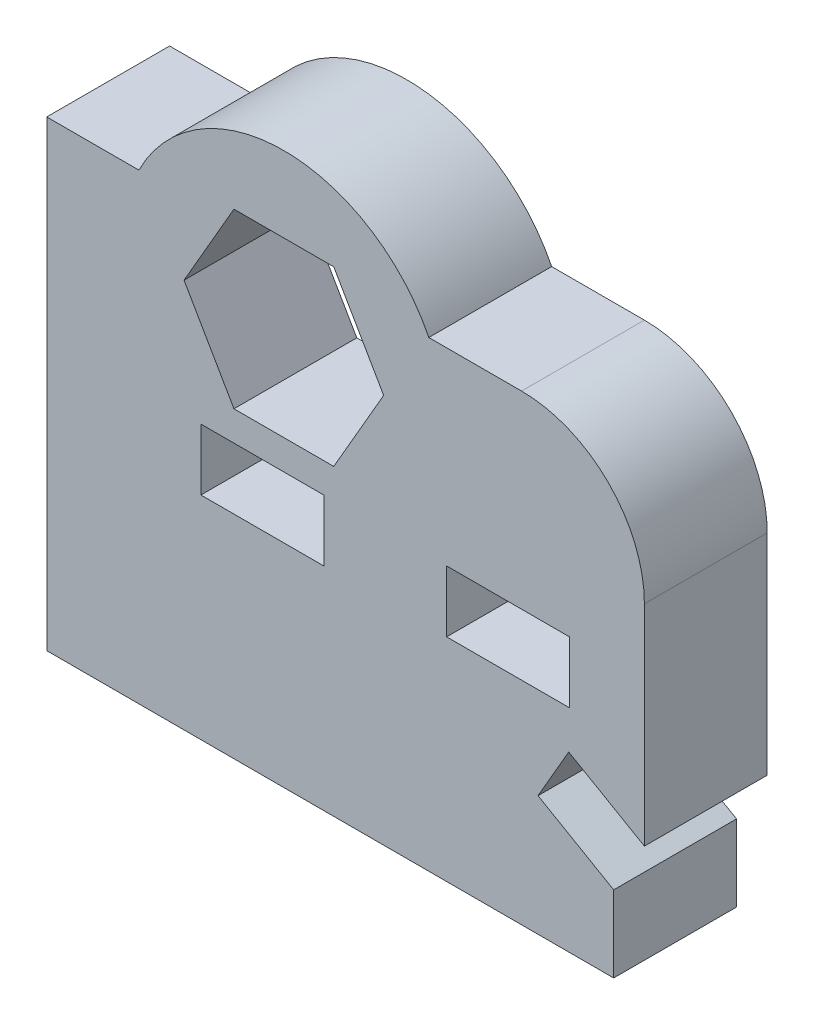
ISO-10303-21;
HEADER;
FILE_DESCRIPTION(('STEP AP214'),'2;1');
FILE_NAME('part.step','',(''),(''),'','','');
FILE_SCHEMA(('AUTOMOTIVE_DESIGN { 1 0 10303 214 1 1 1 1 }'));
ENDSEC;
DATA;
#1=APPLICATION_CONTEXT('core data for automotive mechanical design processes');
#2=APPLICATION_PROTOCOL_DEFINITION('international standard','automotive_design',2000,#1);
#3=PRODUCT_CONTEXT('',#1,'mechanical');
#4=PRODUCT('Part','Part','',(#3));
#5=PRODUCT_RELATED_PRODUCT_CATEGORY('part','',(#4));
#6=PRODUCT_DEFINITION_FORMATION('','',#4);
#7=PRODUCT_DEFINITION_CONTEXT('part definition',#1,'design');
#8=PRODUCT_DEFINITION('design','',#6,#7);
#9=PRODUCT_DEFINITION_SHAPE('','',#8);
#10=(LENGTH_UNIT() NAMED_UNIT(*) SI_UNIT(.MILLI.,.METRE.));
#11=(NAMED_UNIT(*) PLANE_ANGLE_UNIT() SI_UNIT($,.RADIAN.));
#12=(NAMED_UNIT(*) SI_UNIT($,.STERADIAN.) SOLID_ANGLE_UNIT());
#13=UNCERTAINTY_MEASURE_WITH_UNIT(LENGTH_MEASURE(1.E-05),#10,'distance_accuracy_value','');
#14=(GEOMETRIC_REPRESENTATION_CONTEXT(3) GLOBAL_UNCERTAINTY_ASSIGNED_CONTEXT((#13)) GLOBAL_UNIT_ASSIGNED_CONTEXT((#10,
#11,#12)) REPRESENTATION_CONTEXT('',''));
#15=CARTESIAN_POINT('',(0.,0.,0.));
#16=DIRECTION('',(0.,0.,1.));
#17=DIRECTION('',(1.,0.,0.));
#18=AXIS2_PLACEMENT_3D('',#15,#16,#17);
#19=CARTESIAN_POINT('',(13.9396736813884,13.1425512647541,4.));
#20=DIRECTION('',(0.,0.,1.));
#21=DIRECTION('',(1.,0.,0.));
#22=AXIS2_PLACEMENT_3D('',#19,#20,#21);
#23=PLANE('',#22);
#24=DIRECTION('',(0.,-1.,0.));
#25=VECTOR('',#24,1.);
#26=CARTESIAN_POINT('',(11.5,8.99107807997269,4.));
#27=LINE('',#26,#25);
#28=CARTESIAN_POINT('',(11.5,10.9910780799727,4.));
#29=VERTEX_POINT('',#28);
#30=CARTESIAN_POINT('',(11.5,8.99107807997269,4.));
#31=VERTEX_POINT('',#30);
#32=EDGE_CURVE('E252',#29,#31,#27,.T.);
#33=ORIENTED_EDGE('',*,*,#32,.F.);
#34=DIRECTION('',(-1.,0.,0.));
#35=VECTOR('',#34,1.);
#36=CARTESIAN_POINT('',(11.5,10.9910780799727,4.));
#37=LINE('',#36,#35);
#38=CARTESIAN_POINT('',(15.5,10.9910780799727,4.));
#39=VERTEX_POINT('',#38);
#40=EDGE_CURVE('E250',#39,#29,#37,.T.);
#41=ORIENTED_EDGE('',*,*,#40,.F.);
#42=DIRECTION('',(0.,1.,0.));
#43=VECTOR('',#42,1.);
#44=CARTESIAN_POINT('',(15.5,8.99107807997269,4.));
#45=LINE('',#44,#43);
#46=CARTESIAN_POINT('',(15.5,8.99107807997269,4.));
#47=VERTEX_POINT('',#46);
#48=EDGE_CURVE('E258',#47,#39,#45,.T.);
#49=ORIENTED_EDGE('',*,*,#48,.F.);
#50=DIRECTION('',(1.,0.,0.));
#51=VECTOR('',#50,1.);
#52=CARTESIAN_POINT('',(11.5,8.99107807997269,4.));
#53=LINE('',#52,#51);
#54=EDGE_CURVE('E255',#31,#47,#53,.T.);
#55=ORIENTED_EDGE('',*,*,#54,.F.);
#56=EDGE_LOOP('',(#33,#41,#49,#55));
#57=FACE_BOUND('',#56,.T.);
#58=CARTESIAN_POINT('',(13.9396736813884,13.1425512647541,4.));
#59=DIRECTION('',(0.,0.,1.));
#60=DIRECTION('',(1.,0.,0.));
#61=AXIS2_PLACEMENT_3D('',#58,#59,#60);
#62=CIRCLE('',#61,4.);
#63=CARTESIAN_POINT('',(17.9396736813884,13.142551264754,4.));
#64=VERTEX_POINT('',#63);
#65=CARTESIAN_POINT('',(13.9396736813883,17.1425512647541,4.));
#66=VERTEX_POINT('',#65);
#67=EDGE_CURVE('E312',#64,#66,#62,.T.);
#68=ORIENTED_EDGE('',*,*,#67,.T.);
#69=DIRECTION('',(-1.,0.,0.));
#70=VECTOR('',#69,1.);
#71=CARTESIAN_POINT('',(13.9396736813883,17.1425512647541,4.));
#72=LINE('',#71,#70);
#73=CARTESIAN_POINT('',(10.9203263186116,17.1425512647541,4.));
#74=VERTEX_POINT('',#73);
#75=EDGE_CURVE('E315',#66,#74,#72,.T.);
#76=ORIENTED_EDGE('',*,*,#75,.T.);
#77=CARTESIAN_POINT('',(6.2,14.7745717290266,4.));
#78=DIRECTION('',(0.,0.,1.));
#79=DIRECTION('',(1.,0.,0.));
#80=AXIS2_PLACEMENT_3D('',#77,#78,#79);
#81=CIRCLE('',#80,5.28098547960524);
#82=CARTESIAN_POINT('',(1.47967368138841,17.1425512647541,4.));
#83=VERTEX_POINT('',#82);
#84=EDGE_CURVE('E318',#74,#83,#81,.T.);
#85=ORIENTED_EDGE('',*,*,#84,.T.);
#86=DIRECTION('',(-1.,0.,0.));
#87=VECTOR('',#86,1.);
#88=CARTESIAN_POINT('',(1.47967368138841,17.1425512647541,4.));
#89=LINE('',#88,#87);
#90=CARTESIAN_POINT('',(-1.52032631861161,17.1425512647541,4.));
#91=VERTEX_POINT('',#90);
#92=EDGE_CURVE('E320',#83,#91,#89,.T.);
#93=ORIENTED_EDGE('',*,*,#92,.T.);
#94=DIRECTION('',(0.,-1.,0.));
#95=VECTOR('',#94,1.);
#96=CARTESIAN_POINT('',(-1.52032631861161,17.1425512647541,4.));
#97=LINE('',#96,#95);
#98=CARTESIAN_POINT('',(-1.5203263186116,2.0910780799727,4.));
#99=VERTEX_POINT('',#98);
#100=EDGE_CURVE('E322',#91,#99,#97,.T.);
#101=ORIENTED_EDGE('',*,*,#100,.T.);
#102=DIRECTION('',(1.,0.,0.));
#103=VECTOR('',#102,1.);
#104=CARTESIAN_POINT('',(16.9396736813884,2.0910780799727,4.));
#105=LINE('',#104,#103);
#106=CARTESIAN_POINT('',(16.9396736813884,2.0910780799727,4.));
#107=VERTEX_POINT('',#106);
#108=EDGE_CURVE('E324',#99,#107,#105,.T.);
#109=ORIENTED_EDGE('',*,*,#108,.T.);
#110=DIRECTION('',(0.,1.,0.));
#111=VECTOR('',#110,1.);
#112=CARTESIAN_POINT('',(16.9396736813884,4.57735026918963,4.));
#113=LINE('',#112,#111);
#114=CARTESIAN_POINT('',(16.9396736813884,4.57735026918963,4.));
#115=VERTEX_POINT('',#114);
#116=EDGE_CURVE('E326',#107,#115,#113,.T.);
#117=ORIENTED_EDGE('',*,*,#116,.T.);
#118=DIRECTION('',(-0.866025403784442,0.499999999999994,0.));
#119=VECTOR('',#118,1.);
#120=CARTESIAN_POINT('',(14.4755720662506,6.,4.));
#121=LINE('',#120,#119);
#122=CARTESIAN_POINT('',(14.4755720662506,6.,4.));
#123=VERTEX_POINT('',#122);
#124=EDGE_CURVE('E328',#115,#123,#121,.T.);
#125=ORIENTED_EDGE('',*,*,#124,.T.);
#126=DIRECTION('',(0.499999999999994,0.866025403784442,0.));
#127=VECTOR('',#126,1.);
#128=CARTESIAN_POINT('',(14.4755720662506,6.,4.));
#129=LINE('',#128,#127);
#130=CARTESIAN_POINT('',(15.4755720662506,7.73205080756894,4.));
#131=VERTEX_POINT('',#130);
#132=EDGE_CURVE('E330',#123,#131,#129,.T.);
#133=ORIENTED_EDGE('',*,*,#132,.T.);
#134=DIRECTION('',(0.866025403784442,-0.499999999999994,0.));
#135=VECTOR('',#134,1.);
#136=CARTESIAN_POINT('',(15.4755720662506,7.73205080756894,4.));
#137=LINE('',#136,#135);
#138=CARTESIAN_POINT('',(17.9396736813884,6.30940107675856,4.));
#139=VERTEX_POINT('',#138);
#140=EDGE_CURVE('E332',#131,#139,#137,.T.);
#141=ORIENTED_EDGE('',*,*,#140,.T.);
#142=DIRECTION('',(0.,1.,0.));
#143=VECTOR('',#142,1.);
#144=CARTESIAN_POINT('',(17.9396736813884,13.142551264754,4.));
#145=LINE('',#144,#143);
#146=EDGE_CURVE('E334',#139,#64,#145,.T.);
#147=ORIENTED_EDGE('',*,*,#146,.T.);
#148=EDGE_LOOP('',(#68,#76,#85,#93,#101,#109,#117,#125,#133,#141,#147));
#149=FACE_BOUND('',#148,.T.);
#150=DIRECTION('',(0.,-1.,0.));
#151=VECTOR('',#150,1.);
#152=CARTESIAN_POINT('',(3.5,8.99107807997269,4.));
#153=LINE('',#152,#151);
#154=CARTESIAN_POINT('',(3.5,10.9910780799727,4.));
#155=VERTEX_POINT('',#154);
#156=CARTESIAN_POINT('',(3.5,8.99107807997269,4.));
#157=VERTEX_POINT('',#156);
#158=EDGE_CURVE('E283',#155,#157,#153,.T.);
#159=ORIENTED_EDGE('',*,*,#158,.F.);
#160=DIRECTION('',(-1.,0.,0.));
#161=VECTOR('',#160,1.);
#162=CARTESIAN_POINT('',(3.5,10.9910780799727,4.));
#163=LINE('',#162,#161);
#164=CARTESIAN_POINT('',(7.5,10.9910780799727,4.));
#165=VERTEX_POINT('',#164);
#166=EDGE_CURVE('E281',#165,#155,#163,.T.);
#167=ORIENTED_EDGE('',*,*,#166,.F.);
#168=DIRECTION('',(0.,1.,0.));
#169=VECTOR('',#168,1.);
#170=CARTESIAN_POINT('',(7.5,8.99107807997269,4.));
#171=LINE('',#170,#169);
#172=CARTESIAN_POINT('',(7.5,8.99107807997269,4.));
#173=VERTEX_POINT('',#172);
#174=EDGE_CURVE('E289',#173,#165,#171,.T.);
#175=ORIENTED_EDGE('',*,*,#174,.F.);
#176=DIRECTION('',(1.,0.,0.));
#177=VECTOR('',#176,1.);
#178=CARTESIAN_POINT('',(3.5,8.99107807997269,4.));
#179=LINE('',#178,#177);
#180=EDGE_CURVE('E286',#157,#173,#179,.T.);
#181=ORIENTED_EDGE('',*,*,#180,.F.);
#182=EDGE_LOOP('',(#159,#167,#175,#181));
#183=FACE_BOUND('',#182,.T.);
#184=DIRECTION('',(0.499999999999993,-0.866025403784443,0.));
#185=VECTOR('',#184,1.);
#186=CARTESIAN_POINT('',(2.95000000000002,14.7745717290266,4.));
#187=LINE('',#186,#185);
#188=CARTESIAN_POINT('',(2.95000000000002,14.7745717290266,4.));
#189=VERTEX_POINT('',#188);
#190=CARTESIAN_POINT('',(4.57499999999998,11.9599891667272,4.));
#191=VERTEX_POINT('',#190);
#192=EDGE_CURVE('E207',#189,#191,#187,.T.);
#193=ORIENTED_EDGE('',*,*,#192,.F.);
#194=DIRECTION('',(-0.499999999999994,-0.866025403784442,0.));
#195=VECTOR('',#194,1.);
#196=CARTESIAN_POINT('',(4.57499999999998,17.589154291326,4.));
#197=LINE('',#196,#195);
#198=CARTESIAN_POINT('',(4.57499999999998,17.589154291326,4.));
#199=VERTEX_POINT('',#198);
#200=EDGE_CURVE('E199',#199,#189,#197,.T.);
#201=ORIENTED_EDGE('',*,*,#200,.F.);
#202=DIRECTION('',(-1.,0.,0.));
#203=VECTOR('',#202,1.);
#204=CARTESIAN_POINT('',(7.82499999999999,17.589154291326,4.));
#205=LINE('',#204,#203);
#206=CARTESIAN_POINT('',(7.82499999999999,17.589154291326,4.));
#207=VERTEX_POINT('',#206);
#208=EDGE_CURVE('E228',#207,#199,#205,.T.);
#209=ORIENTED_EDGE('',*,*,#208,.F.);
#210=DIRECTION('',(-0.500000000000006,0.866025403784435,0.));
#211=VECTOR('',#210,1.);
#212=CARTESIAN_POINT('',(9.45000000000001,14.7745717290266,4.));
#213=LINE('',#212,#211);
#214=CARTESIAN_POINT('',(9.45000000000001,14.7745717290266,4.));
#215=VERTEX_POINT('',#214);
#216=EDGE_CURVE('E226',#215,#207,#213,.T.);
#217=ORIENTED_EDGE('',*,*,#216,.F.);
#218=DIRECTION('',(0.499999999999995,0.866025403784441,0.));
#219=VECTOR('',#218,1.);
#220=CARTESIAN_POINT('',(7.82500000000002,11.9599891667272,4.));
#221=LINE('',#220,#219);
#222=CARTESIAN_POINT('',(7.82500000000002,11.9599891667272,4.));
#223=VERTEX_POINT('',#222);
#224=EDGE_CURVE('E222',#223,#215,#221,.T.);
#225=ORIENTED_EDGE('',*,*,#224,.F.);
#226=DIRECTION('',(1.,0.,0.));
#227=VECTOR('',#226,1.);
#228=CARTESIAN_POINT('',(4.57499999999998,11.9599891667272,4.));
#229=LINE('',#228,#227);
#230=EDGE_CURVE('E220',#191,#223,#229,.T.);
#231=ORIENTED_EDGE('',*,*,#230,.F.);
#232=EDGE_LOOP('',(#193,#201,#209,#217,#225,#231));
#233=FACE_BOUND('',#232,.T.);
#234=ADVANCED_FACE('F32',(#57,#149,#183,#233),#23,.T.);
#235=CARTESIAN_POINT('',(13.9396736813884,13.1425512647541,0.));
#236=DIRECTION('',(0.,0.,1.));
#237=DIRECTION('',(1.,0.,0.));
#238=AXIS2_PLACEMENT_3D('',#235,#236,#237);
#239=PLANE('',#238);
#240=DIRECTION('',(-1.,0.,0.));
#241=VECTOR('',#240,1.);
#242=CARTESIAN_POINT('',(11.5,10.9910780799727,0.));
#243=LINE('',#242,#241);
#244=CARTESIAN_POINT('',(15.5,10.9910780799727,0.));
#245=VERTEX_POINT('',#244);
#246=CARTESIAN_POINT('',(11.5,10.9910780799727,0.));
#247=VERTEX_POINT('',#246);
#248=EDGE_CURVE('E215',#245,#247,#243,.T.);
#249=ORIENTED_EDGE('',*,*,#248,.T.);
#250=DIRECTION('',(0.,-1.,0.));
#251=VECTOR('',#250,1.);
#252=CARTESIAN_POINT('',(11.5,8.99107807997269,0.));
#253=LINE('',#252,#251);
#254=CARTESIAN_POINT('',(11.5,8.99107807997269,0.));
#255=VERTEX_POINT('',#254);
#256=EDGE_CURVE('E263',#247,#255,#253,.T.);
#257=ORIENTED_EDGE('',*,*,#256,.T.);
#258=DIRECTION('',(1.,0.,0.));
#259=VECTOR('',#258,1.);
#260=CARTESIAN_POINT('',(11.5,8.99107807997269,0.));
#261=LINE('',#260,#259);
#262=CARTESIAN_POINT('',(15.5,8.99107807997269,0.));
#263=VERTEX_POINT('',#262);
#264=EDGE_CURVE('E266',#255,#263,#261,.T.);
#265=ORIENTED_EDGE('',*,*,#264,.T.);
#266=DIRECTION('',(0.,1.,0.));
#267=VECTOR('',#266,1.);
#268=CARTESIAN_POINT('',(15.5,8.99107807997269,0.));
#269=LINE('',#268,#267);
#270=EDGE_CURVE('E253',#263,#245,#269,.T.);
#271=ORIENTED_EDGE('',*,*,#270,.T.);
#272=EDGE_LOOP('',(#249,#257,#265,#271));
#273=FACE_BOUND('',#272,.T.);
#274=CARTESIAN_POINT('',(13.9396736813884,13.1425512647541,0.));
#275=DIRECTION('',(0.,0.,1.));
#276=DIRECTION('',(1.,0.,0.));
#277=AXIS2_PLACEMENT_3D('',#274,#275,#276);
#278=CIRCLE('',#277,4.);
#279=CARTESIAN_POINT('',(17.9396736813884,13.142551264754,0.));
#280=VERTEX_POINT('',#279);
#281=CARTESIAN_POINT('',(13.9396736813883,17.1425512647541,0.));
#282=VERTEX_POINT('',#281);
#283=EDGE_CURVE('E311',#280,#282,#278,.T.);
#284=ORIENTED_EDGE('',*,*,#283,.F.);
#285=DIRECTION('',(0.,1.,0.));
#286=VECTOR('',#285,1.);
#287=CARTESIAN_POINT('',(17.9396736813884,13.142551264754,0.));
#288=LINE('',#287,#286);
#289=CARTESIAN_POINT('',(17.9396736813884,6.30940107675856,0.));
#290=VERTEX_POINT('',#289);
#291=EDGE_CURVE('E316',#290,#280,#288,.T.);
#292=ORIENTED_EDGE('',*,*,#291,.F.);
#293=DIRECTION('',(0.866025403784442,-0.499999999999994,0.));
#294=VECTOR('',#293,1.);
#295=CARTESIAN_POINT('',(15.4755720662506,7.73205080756894,0.));
#296=LINE('',#295,#294);
#297=CARTESIAN_POINT('',(15.4755720662506,7.73205080756894,0.));
#298=VERTEX_POINT('',#297);
#299=EDGE_CURVE('E355',#298,#290,#296,.T.);
#300=ORIENTED_EDGE('',*,*,#299,.F.);
#301=DIRECTION('',(0.499999999999994,0.866025403784442,0.));
#302=VECTOR('',#301,1.);
#303=CARTESIAN_POINT('',(14.4755720662506,6.,0.));
#304=LINE('',#303,#302);
#305=CARTESIAN_POINT('',(14.4755720662506,6.,0.));
#306=VERTEX_POINT('',#305);
#307=EDGE_CURVE('E353',#306,#298,#304,.T.);
#308=ORIENTED_EDGE('',*,*,#307,.F.);
#309=DIRECTION('',(-0.866025403784442,0.499999999999994,0.));
#310=VECTOR('',#309,1.);
#311=CARTESIAN_POINT('',(14.4755720662506,6.,0.));
#312=LINE('',#311,#310);
#313=CARTESIAN_POINT('',(16.9396736813884,4.57735026918963,0.));
#314=VERTEX_POINT('',#313);
#315=EDGE_CURVE('E351',#314,#306,#312,.T.);
#316=ORIENTED_EDGE('',*,*,#315,.F.);
#317=DIRECTION('',(0.,1.,0.));
#318=VECTOR('',#317,1.);
#319=CARTESIAN_POINT('',(16.9396736813884,4.57735026918963,0.));
#320=LINE('',#319,#318);
#321=CARTESIAN_POINT('',(16.9396736813884,2.0910780799727,0.));
#322=VERTEX_POINT('',#321);
#323=EDGE_CURVE('E349',#322,#314,#320,.T.);
#324=ORIENTED_EDGE('',*,*,#323,.F.);
#325=DIRECTION('',(1.,0.,0.));
#326=VECTOR('',#325,1.);
#327=CARTESIAN_POINT('',(16.9396736813884,2.0910780799727,0.));
#328=LINE('',#327,#326);
#329=CARTESIAN_POINT('',(-1.5203263186116,2.0910780799727,0.));
#330=VERTEX_POINT('',#329);
#331=EDGE_CURVE('E347',#330,#322,#328,.T.);
#332=ORIENTED_EDGE('',*,*,#331,.F.);
#333=DIRECTION('',(0.,-1.,0.));
#334=VECTOR('',#333,1.);
#335=CARTESIAN_POINT('',(-1.52032631861161,17.1425512647541,0.));
#336=LINE('',#335,#334);
#337=CARTESIAN_POINT('',(-1.52032631861161,17.1425512647541,0.));
#338=VERTEX_POINT('',#337);
#339=EDGE_CURVE('E345',#338,#330,#336,.T.);
#340=ORIENTED_EDGE('',*,*,#339,.F.);
#341=DIRECTION('',(-1.,0.,0.));
#342=VECTOR('',#341,1.);
#343=CARTESIAN_POINT('',(1.47967368138841,17.1425512647541,0.));
#344=LINE('',#343,#342);
#345=CARTESIAN_POINT('',(1.47967368138841,17.1425512647541,0.));
#346=VERTEX_POINT('',#345);
#347=EDGE_CURVE('E343',#346,#338,#344,.T.);
#348=ORIENTED_EDGE('',*,*,#347,.F.);
#349=CARTESIAN_POINT('',(6.2,14.7745717290266,0.));
#350=DIRECTION('',(0.,0.,1.));
#351=DIRECTION('',(1.,0.,0.));
#352=AXIS2_PLACEMENT_3D('',#349,#350,#351);
#353=CIRCLE('',#352,5.28098547960524);
#354=CARTESIAN_POINT('',(10.9203263186116,17.1425512647541,0.));
#355=VERTEX_POINT('',#354);
#356=EDGE_CURVE('E341',#355,#346,#353,.T.);
#357=ORIENTED_EDGE('',*,*,#356,.F.);
#358=DIRECTION('',(-1.,0.,0.));
#359=VECTOR('',#358,1.);
#360=CARTESIAN_POINT('',(13.9396736813883,17.1425512647541,0.));
#361=LINE('',#360,#359);
#362=EDGE_CURVE('E339',#282,#355,#361,.T.);
#363=ORIENTED_EDGE('',*,*,#362,.F.);
#364=EDGE_LOOP('',(#284,#292,#300,#308,#316,#324,#332,#340,#348,#357,#363));
#365=FACE_BOUND('',#364,.T.);
#366=DIRECTION('',(-1.,0.,0.));
#367=VECTOR('',#366,1.);
#368=CARTESIAN_POINT('',(3.5,10.9910780799727,0.));
#369=LINE('',#368,#367);
#370=CARTESIAN_POINT('',(7.5,10.9910780799727,0.));
#371=VERTEX_POINT('',#370);
#372=CARTESIAN_POINT('',(3.5,10.9910780799727,0.));
#373=VERTEX_POINT('',#372);
#374=EDGE_CURVE('E280',#371,#373,#369,.T.);
#375=ORIENTED_EDGE('',*,*,#374,.T.);
#376=DIRECTION('',(0.,-1.,0.));
#377=VECTOR('',#376,1.);
#378=CARTESIAN_POINT('',(3.5,8.99107807997269,0.));
#379=LINE('',#378,#377);
#380=CARTESIAN_POINT('',(3.5,8.99107807997269,0.));
#381=VERTEX_POINT('',#380);
#382=EDGE_CURVE('E294',#373,#381,#379,.T.);
#383=ORIENTED_EDGE('',*,*,#382,.T.);
#384=DIRECTION('',(1.,0.,0.));
#385=VECTOR('',#384,1.);
#386=CARTESIAN_POINT('',(3.5,8.99107807997269,0.));
#387=LINE('',#386,#385);
#388=CARTESIAN_POINT('',(7.5,8.99107807997269,0.));
#389=VERTEX_POINT('',#388);
#390=EDGE_CURVE('E297',#381,#389,#387,.T.);
#391=ORIENTED_EDGE('',*,*,#390,.T.);
#392=DIRECTION('',(0.,1.,0.));
#393=VECTOR('',#392,1.);
#394=CARTESIAN_POINT('',(7.5,8.99107807997269,0.));
#395=LINE('',#394,#393);
#396=EDGE_CURVE('E284',#389,#371,#395,.T.);
#397=ORIENTED_EDGE('',*,*,#396,.T.);
#398=EDGE_LOOP('',(#375,#383,#391,#397));
#399=FACE_BOUND('',#398,.T.);
#400=DIRECTION('',(-0.499999999999994,-0.866025403784442,0.));
#401=VECTOR('',#400,1.);
#402=CARTESIAN_POINT('',(4.57499999999998,17.589154291326,0.));
#403=LINE('',#402,#401);
#404=CARTESIAN_POINT('',(4.57499999999998,17.589154291326,0.));
#405=VERTEX_POINT('',#404);
#406=CARTESIAN_POINT('',(2.95000000000002,14.7745717290266,0.));
#407=VERTEX_POINT('',#406);
#408=EDGE_CURVE('E55',#405,#407,#403,.T.);
#409=ORIENTED_EDGE('',*,*,#408,.T.);
#410=DIRECTION('',(0.499999999999993,-0.866025403784443,0.));
#411=VECTOR('',#410,1.);
#412=CARTESIAN_POINT('',(2.95000000000002,14.7745717290266,0.));
#413=LINE('',#412,#411);
#414=CARTESIAN_POINT('',(4.57499999999998,11.9599891667272,0.));
#415=VERTEX_POINT('',#414);
#416=EDGE_CURVE('E214',#407,#415,#413,.T.);
#417=ORIENTED_EDGE('',*,*,#416,.T.);
#418=DIRECTION('',(1.,0.,0.));
#419=VECTOR('',#418,1.);
#420=CARTESIAN_POINT('',(4.57499999999998,11.9599891667272,0.));
#421=LINE('',#420,#419);
#422=CARTESIAN_POINT('',(7.82500000000002,11.9599891667272,0.));
#423=VERTEX_POINT('',#422);
#424=EDGE_CURVE('E232',#415,#423,#421,.T.);
#425=ORIENTED_EDGE('',*,*,#424,.T.);
#426=DIRECTION('',(0.499999999999995,0.866025403784441,0.));
#427=VECTOR('',#426,1.);
#428=CARTESIAN_POINT('',(7.82500000000002,11.9599891667272,0.));
#429=LINE('',#428,#427);
#430=CARTESIAN_POINT('',(9.45000000000001,14.7745717290266,0.));
#431=VERTEX_POINT('',#430);
#432=EDGE_CURVE('E235',#423,#431,#429,.T.);
#433=ORIENTED_EDGE('',*,*,#432,.T.);
#434=DIRECTION('',(-0.500000000000006,0.866025403784435,0.));
#435=VECTOR('',#434,1.);
#436=CARTESIAN_POINT('',(9.45000000000001,14.7745717290266,0.));
#437=LINE('',#436,#435);
#438=CARTESIAN_POINT('',(7.82499999999999,17.589154291326,0.));
#439=VERTEX_POINT('',#438);
#440=EDGE_CURVE('E238',#431,#439,#437,.T.);
#441=ORIENTED_EDGE('',*,*,#440,.T.);
#442=DIRECTION('',(-1.,0.,0.));
#443=VECTOR('',#442,1.);
#444=CARTESIAN_POINT('',(7.82499999999999,17.589154291326,0.));
#445=LINE('',#444,#443);
#446=EDGE_CURVE('E208',#439,#405,#445,.T.);
#447=ORIENTED_EDGE('',*,*,#446,.T.);
#448=EDGE_LOOP('',(#409,#417,#425,#433,#441,#447));
#449=FACE_BOUND('',#448,.T.);
#450=ADVANCED_FACE('F394',(#273,#365,#399,#449),#239,.F.);
#451=CARTESIAN_POINT('',(13.9396736813884,13.1425512647541,4.));
#452=DIRECTION('',(0.,0.,-1.));
#453=DIRECTION('',(-1.,0.,0.));
#454=AXIS2_PLACEMENT_3D('',#451,#452,#453);
#455=CYLINDRICAL_SURFACE('',#454,4.);
#456=ORIENTED_EDGE('',*,*,#283,.T.);
#457=DIRECTION('',(0.,0.,-1.));
#458=VECTOR('',#457,1.);
#459=CARTESIAN_POINT('',(13.9396736813883,17.1425512647541,4.));
#460=LINE('',#459,#458);
#461=EDGE_CURVE('E11',#66,#282,#460,.T.);
#462=ORIENTED_EDGE('',*,*,#461,.F.);
#463=ORIENTED_EDGE('',*,*,#67,.F.);
#464=DIRECTION('',(0.,0.,-1.));
#465=VECTOR('',#464,1.);
#466=CARTESIAN_POINT('',(17.9396736813884,13.142551264754,4.));
#467=LINE('',#466,#465);
#468=EDGE_CURVE('E336',#64,#280,#467,.T.);
#469=ORIENTED_EDGE('',*,*,#468,.T.);
#470=EDGE_LOOP('',(#456,#462,#463,#469));
#471=FACE_BOUND('',#470,.T.);
#472=ADVANCED_FACE('F34',(#471),#455,.T.);
#473=CARTESIAN_POINT('',(13.9396736813883,17.1425512647541,4.));
#474=DIRECTION('',(0.,-1.,0.));
#475=DIRECTION('',(1.,0.,0.));
#476=AXIS2_PLACEMENT_3D('',#473,#474,#475);
#477=PLANE('',#476);
#478=ORIENTED_EDGE('',*,*,#362,.T.);
#479=DIRECTION('',(0.,0.,-1.));
#480=VECTOR('',#479,1.);
#481=CARTESIAN_POINT('',(10.9203263186116,17.1425512647541,4.));
#482=LINE('',#481,#480);
#483=EDGE_CURVE('E40',#74,#355,#482,.T.);
#484=ORIENTED_EDGE('',*,*,#483,.F.);
#485=ORIENTED_EDGE('',*,*,#75,.F.);
#486=ORIENTED_EDGE('',*,*,#461,.T.);
#487=EDGE_LOOP('',(#478,#484,#485,#486));
#488=FACE_BOUND('',#487,.T.);
#489=ADVANCED_FACE('F412',(#488),#477,.F.);
#490=CARTESIAN_POINT('',(6.2,14.7745717290266,4.));
#491=DIRECTION('',(0.,0.,-1.));
#492=DIRECTION('',(-1.,0.,0.));
#493=AXIS2_PLACEMENT_3D('',#490,#491,#492);
#494=CYLINDRICAL_SURFACE('',#493,5.28098547960524);
#495=ORIENTED_EDGE('',*,*,#356,.T.);
#496=DIRECTION('',(0.,0.,-1.));
#497=VECTOR('',#496,1.);
#498=CARTESIAN_POINT('',(1.47967368138841,17.1425512647541,4.));
#499=LINE('',#498,#497);
#500=EDGE_CURVE('E381',#83,#346,#499,.T.);
#501=ORIENTED_EDGE('',*,*,#500,.F.);
#502=ORIENTED_EDGE('',*,*,#84,.F.);
#503=ORIENTED_EDGE('',*,*,#483,.T.);
#504=EDGE_LOOP('',(#495,#501,#502,#503));
#505=FACE_BOUND('',#504,.T.);
#506=ADVANCED_FACE('F388',(#505),#494,.T.);
#507=CARTESIAN_POINT('',(1.47967368138841,17.1425512647541,4.));
#508=DIRECTION('',(0.,-1.,0.));
#509=DIRECTION('',(0.,0.,-1.));
#510=AXIS2_PLACEMENT_3D('',#507,#508,#509);
#511=PLANE('',#510);
#512=ORIENTED_EDGE('',*,*,#347,.T.);
#513=DIRECTION('',(0.,0.,-1.));
#514=VECTOR('',#513,1.);
#515=CARTESIAN_POINT('',(-1.52032631861161,17.1425512647541,4.));
#516=LINE('',#515,#514);
#517=EDGE_CURVE('E378',#91,#338,#516,.T.);
#518=ORIENTED_EDGE('',*,*,#517,.F.);
#519=ORIENTED_EDGE('',*,*,#92,.F.);
#520=ORIENTED_EDGE('',*,*,#500,.T.);
#521=EDGE_LOOP('',(#512,#518,#519,#520));
#522=FACE_BOUND('',#521,.T.);
#523=ADVANCED_FACE('F400',(#522),#511,.F.);
#524=CARTESIAN_POINT('',(-1.52032631861161,17.1425512647541,4.));
#525=DIRECTION('',(1.,0.,0.));
#526=DIRECTION('',(0.,1.,0.));
#527=AXIS2_PLACEMENT_3D('',#524,#525,#526);
#528=PLANE('',#527);
#529=ORIENTED_EDGE('',*,*,#339,.T.);
#530=DIRECTION('',(0.,0.,-1.));
#531=VECTOR('',#530,1.);
#532=CARTESIAN_POINT('',(-1.5203263186116,2.0910780799727,4.));
#533=LINE('',#532,#531);
#534=EDGE_CURVE('E375',#99,#330,#533,.T.);
#535=ORIENTED_EDGE('',*,*,#534,.F.);
#536=ORIENTED_EDGE('',*,*,#100,.F.);
#537=ORIENTED_EDGE('',*,*,#517,.T.);
#538=EDGE_LOOP('',(#529,#535,#536,#537));
#539=FACE_BOUND('',#538,.T.);
#540=ADVANCED_FACE('F404',(#539),#528,.F.);
#541=CARTESIAN_POINT('',(16.9396736813884,2.0910780799727,4.));
#542=DIRECTION('',(0.,1.,0.));
#543=DIRECTION('',(-1.,0.,0.));
#544=AXIS2_PLACEMENT_3D('',#541,#542,#543);
#545=PLANE('',#544);
#546=ORIENTED_EDGE('',*,*,#331,.T.);
#547=DIRECTION('',(0.,0.,-1.));
#548=VECTOR('',#547,1.);
#549=CARTESIAN_POINT('',(16.9396736813884,2.0910780799727,4.));
#550=LINE('',#549,#548);
#551=EDGE_CURVE('E372',#107,#322,#550,.T.);
#552=ORIENTED_EDGE('',*,*,#551,.F.);
#553=ORIENTED_EDGE('',*,*,#108,.F.);
#554=ORIENTED_EDGE('',*,*,#534,.T.);
#555=EDGE_LOOP('',(#546,#552,#553,#554));
#556=FACE_BOUND('',#555,.T.);
#557=ADVANCED_FACE('F440',(#556),#545,.F.);
#558=CARTESIAN_POINT('',(16.9396736813884,4.57735026918963,4.));
#559=DIRECTION('',(-1.,0.,0.));
#560=DIRECTION('',(0.,-1.,0.));
#561=AXIS2_PLACEMENT_3D('',#558,#559,#560);
#562=PLANE('',#561);
#563=ORIENTED_EDGE('',*,*,#323,.T.);
#564=DIRECTION('',(0.,0.,-1.));
#565=VECTOR('',#564,1.);
#566=CARTESIAN_POINT('',(16.9396736813884,4.57735026918963,4.));
#567=LINE('',#566,#565);
#568=EDGE_CURVE('E369',#115,#314,#567,.T.);
#569=ORIENTED_EDGE('',*,*,#568,.F.);
#570=ORIENTED_EDGE('',*,*,#116,.F.);
#571=ORIENTED_EDGE('',*,*,#551,.T.);
#572=EDGE_LOOP('',(#563,#569,#570,#571));
#573=FACE_BOUND('',#572,.T.);
#574=ADVANCED_FACE('F438',(#573),#562,.F.);
#575=CARTESIAN_POINT('',(14.4755720662506,6.,4.));
#576=DIRECTION('',(-0.499999999999994,-0.866025403784442,0.));
#577=DIRECTION('',(0.866025403784442,-0.499999999999994,0.));
#578=AXIS2_PLACEMENT_3D('',#575,#576,#577);
#579=PLANE('',#578);
#580=ORIENTED_EDGE('',*,*,#315,.T.);
#581=DIRECTION('',(0.,0.,-1.));
#582=VECTOR('',#581,1.);
#583=CARTESIAN_POINT('',(14.4755720662506,6.,4.));
#584=LINE('',#583,#582);
#585=EDGE_CURVE('E366',#123,#306,#584,.T.);
#586=ORIENTED_EDGE('',*,*,#585,.F.);
#587=ORIENTED_EDGE('',*,*,#124,.F.);
#588=ORIENTED_EDGE('',*,*,#568,.T.);
#589=EDGE_LOOP('',(#580,#586,#587,#588));
#590=FACE_BOUND('',#589,.T.);
#591=ADVANCED_FACE('F433',(#590),#579,.F.);
#592=CARTESIAN_POINT('',(14.4755720662506,6.,4.));
#593=DIRECTION('',(-0.866025403784442,0.499999999999994,0.));
#594=DIRECTION('',(-0.499999999999994,-0.866025403784442,0.));
#595=AXIS2_PLACEMENT_3D('',#592,#593,#594);
#596=PLANE('',#595);
#597=ORIENTED_EDGE('',*,*,#307,.T.);
#598=DIRECTION('',(0.,0.,-1.));
#599=VECTOR('',#598,1.);
#600=CARTESIAN_POINT('',(15.4755720662506,7.73205080756894,4.));
#601=LINE('',#600,#599);
#602=EDGE_CURVE('E363',#131,#298,#601,.T.);
#603=ORIENTED_EDGE('',*,*,#602,.F.);
#604=ORIENTED_EDGE('',*,*,#132,.F.);
#605=ORIENTED_EDGE('',*,*,#585,.T.);
#606=EDGE_LOOP('',(#597,#603,#604,#605));
#607=FACE_BOUND('',#606,.T.);
#608=ADVANCED_FACE('F428',(#607),#596,.F.);
#609=CARTESIAN_POINT('',(15.4755720662506,7.73205080756894,4.));
#610=DIRECTION('',(0.499999999999994,0.866025403784442,0.));
#611=DIRECTION('',(-0.866025403784442,0.499999999999994,0.));
#612=AXIS2_PLACEMENT_3D('',#609,#610,#611);
#613=PLANE('',#612);
#614=ORIENTED_EDGE('',*,*,#299,.T.);
#615=DIRECTION('',(0.,0.,-1.));
#616=VECTOR('',#615,1.);
#617=CARTESIAN_POINT('',(17.9396736813884,6.30940107675856,4.));
#618=LINE('',#617,#616);
#619=EDGE_CURVE('E360',#139,#290,#618,.T.);
#620=ORIENTED_EDGE('',*,*,#619,.F.);
#621=ORIENTED_EDGE('',*,*,#140,.F.);
#622=ORIENTED_EDGE('',*,*,#602,.T.);
#623=EDGE_LOOP('',(#614,#620,#621,#622));
#624=FACE_BOUND('',#623,.T.);
#625=ADVANCED_FACE('F424',(#624),#613,.F.);
#626=CARTESIAN_POINT('',(17.9396736813884,13.142551264754,4.));
#627=DIRECTION('',(-1.,0.,0.));
#628=DIRECTION('',(0.,-1.,0.));
#629=AXIS2_PLACEMENT_3D('',#626,#627,#628);
#630=PLANE('',#629);
#631=ORIENTED_EDGE('',*,*,#291,.T.);
#632=ORIENTED_EDGE('',*,*,#468,.F.);
#633=ORIENTED_EDGE('',*,*,#146,.F.);
#634=ORIENTED_EDGE('',*,*,#619,.T.);
#635=EDGE_LOOP('',(#631,#632,#633,#634));
#636=FACE_BOUND('',#635,.T.);
#637=ADVANCED_FACE('F419',(#636),#630,.F.);
#638=CARTESIAN_POINT('',(3.5,10.9910780799727,4.));
#639=DIRECTION('',(0.,-1.,0.));
#640=DIRECTION('',(0.,0.,-1.));
#641=AXIS2_PLACEMENT_3D('',#638,#639,#640);
#642=PLANE('',#641);
#643=ORIENTED_EDGE('',*,*,#374,.F.);
#644=DIRECTION('',(0.,0.,-1.));
#645=VECTOR('',#644,1.);
#646=CARTESIAN_POINT('',(7.5,10.9910780799727,4.));
#647=LINE('',#646,#645);
#648=EDGE_CURVE('E291',#165,#371,#647,.T.);
#649=ORIENTED_EDGE('',*,*,#648,.F.);
#650=ORIENTED_EDGE('',*,*,#166,.T.);
#651=DIRECTION('',(0.,0.,-1.));
#652=VECTOR('',#651,1.);
#653=CARTESIAN_POINT('',(3.5,10.9910780799727,4.));
#654=LINE('',#653,#652);
#655=EDGE_CURVE('E308',#155,#373,#654,.T.);
#656=ORIENTED_EDGE('',*,*,#655,.T.);
#657=EDGE_LOOP('',(#643,#649,#650,#656));
#658=FACE_BOUND('',#657,.T.);
#659=ADVANCED_FACE('F459',(#658),#642,.T.);
#660=CARTESIAN_POINT('',(3.5,8.99107807997269,4.));
#661=DIRECTION('',(1.,0.,0.));
#662=DIRECTION('',(0.,0.,-1.));
#663=AXIS2_PLACEMENT_3D('',#660,#661,#662);
#664=PLANE('',#663);
#665=ORIENTED_EDGE('',*,*,#382,.F.);
#666=ORIENTED_EDGE('',*,*,#655,.F.);
#667=ORIENTED_EDGE('',*,*,#158,.T.);
#668=DIRECTION('',(0.,0.,-1.));
#669=VECTOR('',#668,1.);
#670=CARTESIAN_POINT('',(3.5,8.99107807997269,4.));
#671=LINE('',#670,#669);
#672=EDGE_CURVE('E306',#157,#381,#671,.T.);
#673=ORIENTED_EDGE('',*,*,#672,.T.);
#674=EDGE_LOOP('',(#665,#666,#667,#673));
#675=FACE_BOUND('',#674,.T.);
#676=ADVANCED_FACE('F491',(#675),#664,.T.);
#677=CARTESIAN_POINT('',(3.5,8.99107807997269,4.));
#678=DIRECTION('',(0.,1.,0.));
#679=DIRECTION('',(0.,0.,1.));
#680=AXIS2_PLACEMENT_3D('',#677,#678,#679);
#681=PLANE('',#680);
#682=ORIENTED_EDGE('',*,*,#390,.F.);
#683=ORIENTED_EDGE('',*,*,#672,.F.);
#684=ORIENTED_EDGE('',*,*,#180,.T.);
#685=DIRECTION('',(0.,0.,-1.));
#686=VECTOR('',#685,1.);
#687=CARTESIAN_POINT('',(7.5,8.99107807997269,4.));
#688=LINE('',#687,#686);
#689=EDGE_CURVE('E304',#173,#389,#688,.T.);
#690=ORIENTED_EDGE('',*,*,#689,.T.);
#691=EDGE_LOOP('',(#682,#683,#684,#690));
#692=FACE_BOUND('',#691,.T.);
#693=ADVANCED_FACE('F498',(#692),#681,.T.);
#694=CARTESIAN_POINT('',(7.5,8.99107807997269,4.));
#695=DIRECTION('',(-1.,0.,0.));
#696=DIRECTION('',(0.,0.,1.));
#697=AXIS2_PLACEMENT_3D('',#694,#695,#696);
#698=PLANE('',#697);
#699=ORIENTED_EDGE('',*,*,#396,.F.);
#700=ORIENTED_EDGE('',*,*,#689,.F.);
#701=ORIENTED_EDGE('',*,*,#174,.T.);
#702=ORIENTED_EDGE('',*,*,#648,.T.);
#703=EDGE_LOOP('',(#699,#700,#701,#702));
#704=FACE_BOUND('',#703,.T.);
#705=ADVANCED_FACE('F505',(#704),#698,.T.);
#706=CARTESIAN_POINT('',(11.5,10.9910780799727,4.));
#707=DIRECTION('',(0.,-1.,0.));
#708=DIRECTION('',(0.,0.,-1.));
#709=AXIS2_PLACEMENT_3D('',#706,#707,#708);
#710=PLANE('',#709);
#711=ORIENTED_EDGE('',*,*,#248,.F.);
#712=DIRECTION('',(0.,0.,-1.));
#713=VECTOR('',#712,1.);
#714=CARTESIAN_POINT('',(15.5,10.9910780799727,4.));
#715=LINE('',#714,#713);
#716=EDGE_CURVE('E260',#39,#245,#715,.T.);
#717=ORIENTED_EDGE('',*,*,#716,.F.);
#718=ORIENTED_EDGE('',*,*,#40,.T.);
#719=DIRECTION('',(0.,0.,-1.));
#720=VECTOR('',#719,1.);
#721=CARTESIAN_POINT('',(11.5,10.9910780799727,4.));
#722=LINE('',#721,#720);
#723=EDGE_CURVE('E277',#29,#247,#722,.T.);
#724=ORIENTED_EDGE('',*,*,#723,.T.);
#725=EDGE_LOOP('',(#711,#717,#718,#724));
#726=FACE_BOUND('',#725,.T.);
#727=ADVANCED_FACE('F513',(#726),#710,.T.);
#728=CARTESIAN_POINT('',(11.5,8.99107807997269,4.));
#729=DIRECTION('',(1.,0.,0.));
#730=DIRECTION('',(0.,0.,-1.));
#731=AXIS2_PLACEMENT_3D('',#728,#729,#730);
#732=PLANE('',#731);
#733=ORIENTED_EDGE('',*,*,#256,.F.);
#734=ORIENTED_EDGE('',*,*,#723,.F.);
#735=ORIENTED_EDGE('',*,*,#32,.T.);
#736=DIRECTION('',(0.,0.,-1.));
#737=VECTOR('',#736,1.);
#738=CARTESIAN_POINT('',(11.5,8.99107807997269,4.));
#739=LINE('',#738,#737);
#740=EDGE_CURVE('E275',#31,#255,#739,.T.);
#741=ORIENTED_EDGE('',*,*,#740,.T.);
#742=EDGE_LOOP('',(#733,#734,#735,#741));
#743=FACE_BOUND('',#742,.T.);
#744=ADVANCED_FACE('F521',(#743),#732,.T.);
#745=CARTESIAN_POINT('',(11.5,8.99107807997269,4.));
#746=DIRECTION('',(0.,1.,0.));
#747=DIRECTION('',(0.,0.,1.));
#748=AXIS2_PLACEMENT_3D('',#745,#746,#747);
#749=PLANE('',#748);
#750=ORIENTED_EDGE('',*,*,#264,.F.);
#751=ORIENTED_EDGE('',*,*,#740,.F.);
#752=ORIENTED_EDGE('',*,*,#54,.T.);
#753=DIRECTION('',(0.,0.,-1.));
#754=VECTOR('',#753,1.);
#755=CARTESIAN_POINT('',(15.5,8.99107807997269,4.));
#756=LINE('',#755,#754);
#757=EDGE_CURVE('E273',#47,#263,#756,.T.);
#758=ORIENTED_EDGE('',*,*,#757,.T.);
#759=EDGE_LOOP('',(#750,#751,#752,#758));
#760=FACE_BOUND('',#759,.T.);
#761=ADVANCED_FACE('F529',(#760),#749,.T.);
#762=CARTESIAN_POINT('',(15.5,8.99107807997269,4.));
#763=DIRECTION('',(-1.,0.,0.));
#764=DIRECTION('',(0.,0.,1.));
#765=AXIS2_PLACEMENT_3D('',#762,#763,#764);
#766=PLANE('',#765);
#767=ORIENTED_EDGE('',*,*,#270,.F.);
#768=ORIENTED_EDGE('',*,*,#757,.F.);
#769=ORIENTED_EDGE('',*,*,#48,.T.);
#770=ORIENTED_EDGE('',*,*,#716,.T.);
#771=EDGE_LOOP('',(#767,#768,#769,#770));
#772=FACE_BOUND('',#771,.T.);
#773=ADVANCED_FACE('F537',(#772),#766,.T.);
#774=CARTESIAN_POINT('',(4.57499999999998,17.589154291326,4.));
#775=DIRECTION('',(0.866025403784442,-0.499999999999994,0.));
#776=DIRECTION('',(0.499999999999994,0.866025403784442,0.));
#777=AXIS2_PLACEMENT_3D('',#774,#775,#776);
#778=PLANE('',#777);
#779=ORIENTED_EDGE('',*,*,#408,.F.);
#780=DIRECTION('',(0.,0.,-1.));
#781=VECTOR('',#780,1.);
#782=CARTESIAN_POINT('',(4.57499999999998,17.589154291326,4.));
#783=LINE('',#782,#781);
#784=EDGE_CURVE('E203',#199,#405,#783,.T.);
#785=ORIENTED_EDGE('',*,*,#784,.F.);
#786=ORIENTED_EDGE('',*,*,#200,.T.);
#787=DIRECTION('',(0.,0.,-1.));
#788=VECTOR('',#787,1.);
#789=CARTESIAN_POINT('',(2.95000000000002,14.7745717290266,4.));
#790=LINE('',#789,#788);
#791=EDGE_CURVE('E202',#189,#407,#790,.T.);
#792=ORIENTED_EDGE('',*,*,#791,.T.);
#793=EDGE_LOOP('',(#779,#785,#786,#792));
#794=FACE_BOUND('',#793,.T.);
#795=ADVANCED_FACE('F201',(#794),#778,.T.);
#796=CARTESIAN_POINT('',(2.95000000000002,14.7745717290266,4.));
#797=DIRECTION('',(0.866025403784443,0.499999999999993,0.));
#798=DIRECTION('',(-0.499999999999993,0.866025403784443,0.));
#799=AXIS2_PLACEMENT_3D('',#796,#797,#798);
#800=PLANE('',#799);
#801=ORIENTED_EDGE('',*,*,#416,.F.);
#802=ORIENTED_EDGE('',*,*,#791,.F.);
#803=ORIENTED_EDGE('',*,*,#192,.T.);
#804=DIRECTION('',(0.,0.,-1.));
#805=VECTOR('',#804,1.);
#806=CARTESIAN_POINT('',(4.57499999999998,11.9599891667272,4.));
#807=LINE('',#806,#805);
#808=EDGE_CURVE('E216',#191,#415,#807,.T.);
#809=ORIENTED_EDGE('',*,*,#808,.T.);
#810=EDGE_LOOP('',(#801,#802,#803,#809));
#811=FACE_BOUND('',#810,.T.);
#812=ADVANCED_FACE('F211',(#811),#800,.T.);
#813=CARTESIAN_POINT('',(4.57499999999998,11.9599891667272,4.));
#814=DIRECTION('',(0.,1.,0.));
#815=DIRECTION('',(0.,0.,1.));
#816=AXIS2_PLACEMENT_3D('',#813,#814,#815);
#817=PLANE('',#816);
#818=ORIENTED_EDGE('',*,*,#424,.F.);
#819=ORIENTED_EDGE('',*,*,#808,.F.);
#820=ORIENTED_EDGE('',*,*,#230,.T.);
#821=DIRECTION('',(0.,0.,-1.));
#822=VECTOR('',#821,1.);
#823=CARTESIAN_POINT('',(7.82500000000002,11.9599891667272,4.));
#824=LINE('',#823,#822);
#825=EDGE_CURVE('E247',#223,#423,#824,.T.);
#826=ORIENTED_EDGE('',*,*,#825,.T.);
#827=EDGE_LOOP('',(#818,#819,#820,#826));
#828=FACE_BOUND('',#827,.T.);
#829=ADVANCED_FACE('F558',(#828),#817,.T.);
#830=CARTESIAN_POINT('',(7.82500000000002,11.9599891667272,4.));
#831=DIRECTION('',(-0.866025403784441,0.499999999999995,0.));
#832=DIRECTION('',(-0.499999999999995,-0.866025403784442,0.));
#833=AXIS2_PLACEMENT_3D('',#830,#831,#832);
#834=PLANE('',#833);
#835=ORIENTED_EDGE('',*,*,#432,.F.);
#836=ORIENTED_EDGE('',*,*,#825,.F.);
#837=ORIENTED_EDGE('',*,*,#224,.T.);
#838=DIRECTION('',(0.,0.,-1.));
#839=VECTOR('',#838,1.);
#840=CARTESIAN_POINT('',(9.45000000000001,14.7745717290266,4.));
#841=LINE('',#840,#839);
#842=EDGE_CURVE('E245',#215,#431,#841,.T.);
#843=ORIENTED_EDGE('',*,*,#842,.T.);
#844=EDGE_LOOP('',(#835,#836,#837,#843));
#845=FACE_BOUND('',#844,.T.);
#846=ADVANCED_FACE('F565',(#845),#834,.T.);
#847=CARTESIAN_POINT('',(9.45000000000001,14.7745717290266,4.));
#848=DIRECTION('',(-0.866025403784435,-0.500000000000006,0.));
#849=DIRECTION('',(0.500000000000006,-0.866025403784435,0.));
#850=AXIS2_PLACEMENT_3D('',#847,#848,#849);
#851=PLANE('',#850);
#852=ORIENTED_EDGE('',*,*,#440,.F.);
#853=ORIENTED_EDGE('',*,*,#842,.F.);
#854=ORIENTED_EDGE('',*,*,#216,.T.);
#855=DIRECTION('',(0.,0.,-1.));
#856=VECTOR('',#855,1.);
#857=CARTESIAN_POINT('',(7.82499999999999,17.589154291326,4.));
#858=LINE('',#857,#856);
#859=EDGE_CURVE('E47',#207,#439,#858,.T.);
#860=ORIENTED_EDGE('',*,*,#859,.T.);
#861=EDGE_LOOP('',(#852,#853,#854,#860));
#862=FACE_BOUND('',#861,.T.);
#863=ADVANCED_FACE('F573',(#862),#851,.T.);
#864=CARTESIAN_POINT('',(7.82499999999999,17.589154291326,4.));
#865=DIRECTION('',(0.,-1.,0.));
#866=DIRECTION('',(1.,0.,0.));
#867=AXIS2_PLACEMENT_3D('',#864,#865,#866);
#868=PLANE('',#867);
#869=ORIENTED_EDGE('',*,*,#446,.F.);
#870=ORIENTED_EDGE('',*,*,#859,.F.);
#871=ORIENTED_EDGE('',*,*,#208,.T.);
#872=ORIENTED_EDGE('',*,*,#784,.T.);
#873=EDGE_LOOP('',(#869,#870,#871,#872));
#874=FACE_BOUND('',#873,.T.);
#875=ADVANCED_FACE('F581',(#874),#868,.T.);
#876=CLOSED_SHELL('',(#234,#450,#472,#489,#506,#523,#540,#557,#574,#591,#608,#625,#637,#659,
#676,#693,#705,#727,#744,#761,#773,#795,#812,#829,#846,#863,#875));
#877=MANIFOLD_SOLID_BREP('B2',#876);
#878=ADVANCED_BREP_SHAPE_REPRESENTATION('',(#18,#877),#14);
#879=SHAPE_DEFINITION_REPRESENTATION(#9,#878);
ENDSEC;
END-ISO-10303-21;
